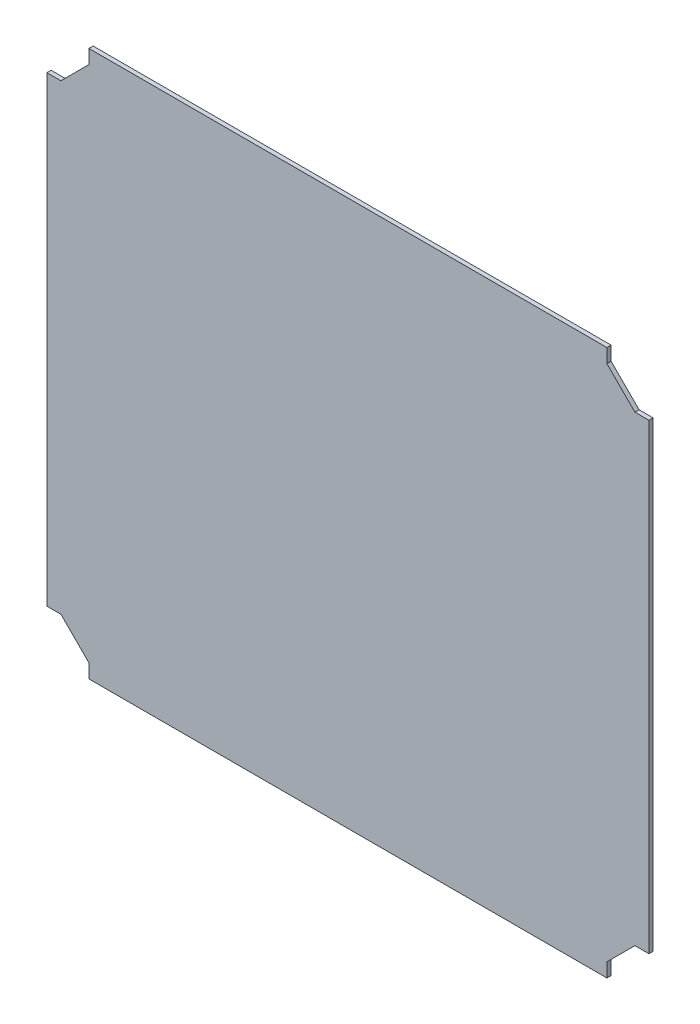
ISO-10303-21;
HEADER;
FILE_DESCRIPTION(('STEP AP214'),'2;1');
FILE_NAME('part.step','',(''),(''),'','','');
FILE_SCHEMA(('AUTOMOTIVE_DESIGN { 1 0 10303 214 1 1 1 1 }'));
ENDSEC;
DATA;
#1=APPLICATION_CONTEXT('core data for automotive mechanical design processes');
#2=APPLICATION_PROTOCOL_DEFINITION('international standard','automotive_design',2000,#1);
#3=PRODUCT_CONTEXT('',#1,'mechanical');
#4=PRODUCT('Part','Part','',(#3));
#5=PRODUCT_RELATED_PRODUCT_CATEGORY('part','',(#4));
#6=PRODUCT_DEFINITION_FORMATION('','',#4);
#7=PRODUCT_DEFINITION_CONTEXT('part definition',#1,'design');
#8=PRODUCT_DEFINITION('design','',#6,#7);
#9=PRODUCT_DEFINITION_SHAPE('','',#8);
#10=(LENGTH_UNIT() NAMED_UNIT(*) SI_UNIT(.MILLI.,.METRE.));
#11=(NAMED_UNIT(*) PLANE_ANGLE_UNIT() SI_UNIT($,.RADIAN.));
#12=(NAMED_UNIT(*) SI_UNIT($,.STERADIAN.) SOLID_ANGLE_UNIT());
#13=UNCERTAINTY_MEASURE_WITH_UNIT(LENGTH_MEASURE(1.E-05),#10,'distance_accuracy_value','');
#14=(GEOMETRIC_REPRESENTATION_CONTEXT(3) GLOBAL_UNCERTAINTY_ASSIGNED_CONTEXT((#13)) GLOBAL_UNIT_ASSIGNED_CONTEXT((#10,
#11,#12)) REPRESENTATION_CONTEXT('',''));
#15=CARTESIAN_POINT('',(0.,0.,0.));
#16=DIRECTION('',(0.,0.,1.));
#17=DIRECTION('',(1.,0.,0.));
#18=AXIS2_PLACEMENT_3D('',#15,#16,#17);
#19=CARTESIAN_POINT('',(-430.,-390.,6.));
#20=DIRECTION('',(1.,0.,0.));
#21=DIRECTION('',(0.,0.,-1.));
#22=AXIS2_PLACEMENT_3D('',#19,#20,#21);
#23=PLANE('',#22);
#24=DIRECTION('',(0.,-1.,0.));
#25=VECTOR('',#24,1.);
#26=CARTESIAN_POINT('',(-430.,-390.,0.));
#27=LINE('',#26,#25);
#28=CARTESIAN_POINT('',(-430.,330.,0.));
#29=VERTEX_POINT('',#28);
#30=CARTESIAN_POINT('',(-430.,-330.,0.));
#31=VERTEX_POINT('',#30);
#32=EDGE_CURVE('E184',#29,#31,#27,.T.);
#33=ORIENTED_EDGE('',*,*,#32,.T.);
#34=DIRECTION('',(0.,0.,1.));
#35=VECTOR('',#34,1.);
#36=CARTESIAN_POINT('',(-430.,-330.,-84.8528137423858));
#37=LINE('',#36,#35);
#38=CARTESIAN_POINT('',(-430.,-330.,6.));
#39=VERTEX_POINT('',#38);
#40=EDGE_CURVE('E291',#31,#39,#37,.T.);
#41=ORIENTED_EDGE('',*,*,#40,.T.);
#42=DIRECTION('',(0.,-1.,0.));
#43=VECTOR('',#42,1.);
#44=CARTESIAN_POINT('',(-430.,-390.,6.));
#45=LINE('',#44,#43);
#46=CARTESIAN_POINT('',(-430.,330.,6.));
#47=VERTEX_POINT('',#46);
#48=EDGE_CURVE('E195',#47,#39,#45,.T.);
#49=ORIENTED_EDGE('',*,*,#48,.F.);
#50=DIRECTION('',(0.,0.,1.));
#51=VECTOR('',#50,1.);
#52=CARTESIAN_POINT('',(-430.,330.,-84.8528137423858));
#53=LINE('',#52,#51);
#54=EDGE_CURVE('E314',#29,#47,#53,.T.);
#55=ORIENTED_EDGE('',*,*,#54,.F.);
#56=EDGE_LOOP('',(#33,#41,#49,#55));
#57=FACE_BOUND('',#56,.T.);
#58=ADVANCED_FACE('F35',(#57),#23,.F.);
#59=CARTESIAN_POINT('',(430.,-390.,6.));
#60=DIRECTION('',(0.,1.,0.));
#61=DIRECTION('',(-1.,0.,0.));
#62=AXIS2_PLACEMENT_3D('',#59,#60,#61);
#63=PLANE('',#62);
#64=DIRECTION('',(1.,0.,0.));
#65=VECTOR('',#64,1.);
#66=CARTESIAN_POINT('',(430.,-390.,6.));
#67=LINE('',#66,#65);
#68=CARTESIAN_POINT('',(-370.,-390.,6.));
#69=VERTEX_POINT('',#68);
#70=CARTESIAN_POINT('',(370.,-390.,6.));
#71=VERTEX_POINT('',#70);
#72=EDGE_CURVE('E180',#69,#71,#67,.T.);
#73=ORIENTED_EDGE('',*,*,#72,.F.);
#74=DIRECTION('',(0.,0.,1.));
#75=VECTOR('',#74,1.);
#76=CARTESIAN_POINT('',(-370.,-390.,-84.8528137423858));
#77=LINE('',#76,#75);
#78=CARTESIAN_POINT('',(-370.,-390.,0.));
#79=VERTEX_POINT('',#78);
#80=EDGE_CURVE('E305',#79,#69,#77,.T.);
#81=ORIENTED_EDGE('',*,*,#80,.F.);
#82=DIRECTION('',(1.,0.,0.));
#83=VECTOR('',#82,1.);
#84=CARTESIAN_POINT('',(430.,-390.,0.));
#85=LINE('',#84,#83);
#86=CARTESIAN_POINT('',(370.,-390.,0.));
#87=VERTEX_POINT('',#86);
#88=EDGE_CURVE('E187',#79,#87,#85,.T.);
#89=ORIENTED_EDGE('',*,*,#88,.T.);
#90=DIRECTION('',(0.,0.,1.));
#91=VECTOR('',#90,1.);
#92=CARTESIAN_POINT('',(370.,-390.,-84.8528137423858));
#93=LINE('',#92,#91);
#94=EDGE_CURVE('E325',#87,#71,#93,.T.);
#95=ORIENTED_EDGE('',*,*,#94,.T.);
#96=EDGE_LOOP('',(#73,#81,#89,#95));
#97=FACE_BOUND('',#96,.T.);
#98=ADVANCED_FACE('F250',(#97),#63,.F.);
#99=CARTESIAN_POINT('',(430.,-390.,6.));
#100=DIRECTION('',(-1.,0.,0.));
#101=DIRECTION('',(0.,0.,1.));
#102=AXIS2_PLACEMENT_3D('',#99,#100,#101);
#103=PLANE('',#102);
#104=DIRECTION('',(0.,1.,0.));
#105=VECTOR('',#104,1.);
#106=CARTESIAN_POINT('',(430.,-390.,6.));
#107=LINE('',#106,#105);
#108=CARTESIAN_POINT('',(430.,-330.,6.));
#109=VERTEX_POINT('',#108);
#110=CARTESIAN_POINT('',(430.,330.,6.));
#111=VERTEX_POINT('',#110);
#112=EDGE_CURVE('E174',#109,#111,#107,.T.);
#113=ORIENTED_EDGE('',*,*,#112,.F.);
#114=DIRECTION('',(0.,0.,1.));
#115=VECTOR('',#114,1.);
#116=CARTESIAN_POINT('',(430.,-330.,-84.8528137423858));
#117=LINE('',#116,#115);
#118=CARTESIAN_POINT('',(430.,-330.,0.));
#119=VERTEX_POINT('',#118);
#120=EDGE_CURVE('E330',#119,#109,#117,.T.);
#121=ORIENTED_EDGE('',*,*,#120,.F.);
#122=DIRECTION('',(0.,1.,0.));
#123=VECTOR('',#122,1.);
#124=CARTESIAN_POINT('',(430.,-390.,0.));
#125=LINE('',#124,#123);
#126=CARTESIAN_POINT('',(430.,330.,0.));
#127=VERTEX_POINT('',#126);
#128=EDGE_CURVE('E191',#119,#127,#125,.T.);
#129=ORIENTED_EDGE('',*,*,#128,.T.);
#130=DIRECTION('',(0.,0.,1.));
#131=VECTOR('',#130,1.);
#132=CARTESIAN_POINT('',(430.,330.,-84.8528137423858));
#133=LINE('',#132,#131);
#134=EDGE_CURVE('E159',#127,#111,#133,.T.);
#135=ORIENTED_EDGE('',*,*,#134,.T.);
#136=EDGE_LOOP('',(#113,#121,#129,#135));
#137=FACE_BOUND('',#136,.T.);
#138=ADVANCED_FACE('F256',(#137),#103,.F.);
#139=CARTESIAN_POINT('',(430.,390.,6.));
#140=DIRECTION('',(0.,-1.,0.));
#141=DIRECTION('',(1.,0.,0.));
#142=AXIS2_PLACEMENT_3D('',#139,#140,#141);
#143=PLANE('',#142);
#144=DIRECTION('',(-1.,0.,0.));
#145=VECTOR('',#144,1.);
#146=CARTESIAN_POINT('',(430.,390.,6.));
#147=LINE('',#146,#145);
#148=CARTESIAN_POINT('',(370.,390.,6.));
#149=VERTEX_POINT('',#148);
#150=CARTESIAN_POINT('',(-370.,390.,6.));
#151=VERTEX_POINT('',#150);
#152=EDGE_CURVE('E165',#149,#151,#147,.T.);
#153=ORIENTED_EDGE('',*,*,#152,.F.);
#154=DIRECTION('',(0.,0.,1.));
#155=VECTOR('',#154,1.);
#156=CARTESIAN_POINT('',(370.,390.,-84.8528137423858));
#157=LINE('',#156,#155);
#158=CARTESIAN_POINT('',(370.,390.,0.));
#159=VERTEX_POINT('',#158);
#160=EDGE_CURVE('E148',#159,#149,#157,.T.);
#161=ORIENTED_EDGE('',*,*,#160,.F.);
#162=DIRECTION('',(-1.,0.,0.));
#163=VECTOR('',#162,1.);
#164=CARTESIAN_POINT('',(430.,390.,0.));
#165=LINE('',#164,#163);
#166=CARTESIAN_POINT('',(-370.,390.,0.));
#167=VERTEX_POINT('',#166);
#168=EDGE_CURVE('E194',#159,#167,#165,.T.);
#169=ORIENTED_EDGE('',*,*,#168,.T.);
#170=DIRECTION('',(0.,0.,1.));
#171=VECTOR('',#170,1.);
#172=CARTESIAN_POINT('',(-370.,390.,-84.8528137423858));
#173=LINE('',#172,#171);
#174=EDGE_CURVE('E172',#167,#151,#173,.T.);
#175=ORIENTED_EDGE('',*,*,#174,.T.);
#176=EDGE_LOOP('',(#153,#161,#169,#175));
#177=FACE_BOUND('',#176,.T.);
#178=ADVANCED_FACE('F171',(#177),#143,.F.);
#179=CARTESIAN_POINT('',(0.,0.,6.));
#180=DIRECTION('',(0.,0.,1.));
#181=DIRECTION('',(1.,0.,0.));
#182=AXIS2_PLACEMENT_3D('',#179,#180,#181);
#183=PLANE('',#182);
#184=DIRECTION('',(-1.,0.,0.));
#185=VECTOR('',#184,1.);
#186=CARTESIAN_POINT('',(-430.,-330.,6.));
#187=LINE('',#186,#185);
#188=CARTESIAN_POINT('',(-410.,-330.,6.));
#189=VERTEX_POINT('',#188);
#190=EDGE_CURVE('E303',#189,#39,#187,.T.);
#191=ORIENTED_EDGE('',*,*,#190,.F.);
#192=DIRECTION('',(-0.707106781186552,0.707106781186543,0.));
#193=VECTOR('',#192,1.);
#194=CARTESIAN_POINT('',(-410.,-330.,6.00000000000001));
#195=LINE('',#194,#193);
#196=CARTESIAN_POINT('',(-370.,-370.,6.));
#197=VERTEX_POINT('',#196);
#198=EDGE_CURVE('E212',#189,#197,#195,.F.);
#199=ORIENTED_EDGE('',*,*,#198,.T.);
#200=DIRECTION('',(0.,1.,0.));
#201=VECTOR('',#200,1.);
#202=CARTESIAN_POINT('',(-370.,-390.,6.));
#203=LINE('',#202,#201);
#204=EDGE_CURVE('E300',#69,#197,#203,.T.);
#205=ORIENTED_EDGE('',*,*,#204,.F.);
#206=ORIENTED_EDGE('',*,*,#72,.T.);
#207=DIRECTION('',(0.,-1.,0.));
#208=VECTOR('',#207,1.);
#209=CARTESIAN_POINT('',(370.,-390.,6.));
#210=LINE('',#209,#208);
#211=CARTESIAN_POINT('',(370.,-370.,6.));
#212=VERTEX_POINT('',#211);
#213=EDGE_CURVE('E295',#212,#71,#210,.T.);
#214=ORIENTED_EDGE('',*,*,#213,.F.);
#215=DIRECTION('',(-0.707106781186543,-0.707106781186552,0.));
#216=VECTOR('',#215,1.);
#217=CARTESIAN_POINT('',(370.,-370.,6.00000000000001));
#218=LINE('',#217,#216);
#219=CARTESIAN_POINT('',(410.,-330.,6.));
#220=VERTEX_POINT('',#219);
#221=EDGE_CURVE('E216',#212,#220,#218,.F.);
#222=ORIENTED_EDGE('',*,*,#221,.T.);
#223=DIRECTION('',(-1.,0.,0.));
#224=VECTOR('',#223,1.);
#225=CARTESIAN_POINT('',(430.,-330.,6.));
#226=LINE('',#225,#224);
#227=EDGE_CURVE('E292',#109,#220,#226,.T.);
#228=ORIENTED_EDGE('',*,*,#227,.F.);
#229=ORIENTED_EDGE('',*,*,#112,.T.);
#230=DIRECTION('',(1.,0.,0.));
#231=VECTOR('',#230,1.);
#232=CARTESIAN_POINT('',(430.,330.,6.));
#233=LINE('',#232,#231);
#234=CARTESIAN_POINT('',(410.000000000001,330.,6.));
#235=VERTEX_POINT('',#234);
#236=EDGE_CURVE('E160',#235,#111,#233,.T.);
#237=ORIENTED_EDGE('',*,*,#236,.F.);
#238=DIRECTION('',(0.707106781186551,-0.707106781186544,0.));
#239=VECTOR('',#238,1.);
#240=CARTESIAN_POINT('',(410.000000000001,330.,6.00000000000001));
#241=LINE('',#240,#239);
#242=CARTESIAN_POINT('',(370.,370.,6.));
#243=VERTEX_POINT('',#242);
#244=EDGE_CURVE('E167',#235,#243,#241,.F.);
#245=ORIENTED_EDGE('',*,*,#244,.T.);
#246=DIRECTION('',(0.,-1.,0.));
#247=VECTOR('',#246,1.);
#248=CARTESIAN_POINT('',(370.,390.,6.));
#249=LINE('',#248,#247);
#250=EDGE_CURVE('E151',#149,#243,#249,.T.);
#251=ORIENTED_EDGE('',*,*,#250,.F.);
#252=ORIENTED_EDGE('',*,*,#152,.T.);
#253=DIRECTION('',(0.,1.,0.));
#254=VECTOR('',#253,1.);
#255=CARTESIAN_POINT('',(-370.,390.,6.));
#256=LINE('',#255,#254);
#257=CARTESIAN_POINT('',(-370.,370.000000000001,6.));
#258=VERTEX_POINT('',#257);
#259=EDGE_CURVE('E312',#258,#151,#256,.T.);
#260=ORIENTED_EDGE('',*,*,#259,.F.);
#261=DIRECTION('',(0.707106781186544,0.707106781186551,0.));
#262=VECTOR('',#261,1.);
#263=CARTESIAN_POINT('',(-370.,370.000000000001,6.00000000000001));
#264=LINE('',#263,#262);
#265=CARTESIAN_POINT('',(-410.,330.,6.));
#266=VERTEX_POINT('',#265);
#267=EDGE_CURVE('E44',#258,#266,#264,.F.);
#268=ORIENTED_EDGE('',*,*,#267,.T.);
#269=DIRECTION('',(1.,0.,0.));
#270=VECTOR('',#269,1.);
#271=CARTESIAN_POINT('',(-430.,330.,6.));
#272=LINE('',#271,#270);
#273=EDGE_CURVE('E235',#47,#266,#272,.T.);
#274=ORIENTED_EDGE('',*,*,#273,.F.);
#275=ORIENTED_EDGE('',*,*,#48,.T.);
#276=EDGE_LOOP('',(#191,#199,#205,#206,#214,#222,#228,#229,#237,#245,#251,#252,#260,#268,#274,#275));
#277=FACE_BOUND('',#276,.T.);
#278=ADVANCED_FACE('F164',(#277),#183,.T.);
#279=CARTESIAN_POINT('',(0.,0.,0.));
#280=DIRECTION('',(0.,0.,1.));
#281=DIRECTION('',(1.,0.,0.));
#282=AXIS2_PLACEMENT_3D('',#279,#280,#281);
#283=PLANE('',#282);
#284=DIRECTION('',(0.,-1.,0.));
#285=VECTOR('',#284,1.);
#286=CARTESIAN_POINT('',(-370.,-390.,0.));
#287=LINE('',#286,#285);
#288=CARTESIAN_POINT('',(-370.,-370.,0.));
#289=VERTEX_POINT('',#288);
#290=EDGE_CURVE('E288',#289,#79,#287,.T.);
#291=ORIENTED_EDGE('',*,*,#290,.F.);
#292=DIRECTION('',(0.707106781186552,-0.707106781186543,0.));
#293=VECTOR('',#292,1.);
#294=CARTESIAN_POINT('',(-369.999999999997,-370.000000000003,0.));
#295=LINE('',#294,#293);
#296=CARTESIAN_POINT('',(-410.,-330.,0.));
#297=VERTEX_POINT('',#296);
#298=EDGE_CURVE('E214',#289,#297,#295,.F.);
#299=ORIENTED_EDGE('',*,*,#298,.T.);
#300=DIRECTION('',(1.,0.,0.));
#301=VECTOR('',#300,1.);
#302=CARTESIAN_POINT('',(-430.,-330.,0.));
#303=LINE('',#302,#301);
#304=EDGE_CURVE('E286',#31,#297,#303,.T.);
#305=ORIENTED_EDGE('',*,*,#304,.F.);
#306=ORIENTED_EDGE('',*,*,#32,.F.);
#307=DIRECTION('',(-1.,0.,0.));
#308=VECTOR('',#307,1.);
#309=CARTESIAN_POINT('',(-430.,330.,0.));
#310=LINE('',#309,#308);
#311=CARTESIAN_POINT('',(-410.,330.,0.));
#312=VERTEX_POINT('',#311);
#313=EDGE_CURVE('E188',#312,#29,#310,.T.);
#314=ORIENTED_EDGE('',*,*,#313,.F.);
#315=DIRECTION('',(-0.707106781186544,-0.707106781186551,0.));
#316=VECTOR('',#315,1.);
#317=CARTESIAN_POINT('',(-370.000000000002,369.999999999998,0.));
#318=LINE('',#317,#316);
#319=CARTESIAN_POINT('',(-370.,370.000000000001,0.));
#320=VERTEX_POINT('',#319);
#321=EDGE_CURVE('E11',#312,#320,#318,.F.);
#322=ORIENTED_EDGE('',*,*,#321,.T.);
#323=DIRECTION('',(0.,-1.,0.));
#324=VECTOR('',#323,1.);
#325=CARTESIAN_POINT('',(-370.,390.,0.));
#326=LINE('',#325,#324);
#327=EDGE_CURVE('E308',#167,#320,#326,.T.);
#328=ORIENTED_EDGE('',*,*,#327,.F.);
#329=ORIENTED_EDGE('',*,*,#168,.F.);
#330=DIRECTION('',(0.,1.,0.));
#331=VECTOR('',#330,1.);
#332=CARTESIAN_POINT('',(370.,390.,0.));
#333=LINE('',#332,#331);
#334=CARTESIAN_POINT('',(370.,370.,0.));
#335=VERTEX_POINT('',#334);
#336=EDGE_CURVE('E154',#335,#159,#333,.T.);
#337=ORIENTED_EDGE('',*,*,#336,.F.);
#338=DIRECTION('',(-0.707106781186551,0.707106781186544,0.));
#339=VECTOR('',#338,1.);
#340=CARTESIAN_POINT('',(369.999999999998,370.000000000002,0.));
#341=LINE('',#340,#339);
#342=CARTESIAN_POINT('',(410.000000000001,330.,0.));
#343=VERTEX_POINT('',#342);
#344=EDGE_CURVE('E221',#335,#343,#341,.F.);
#345=ORIENTED_EDGE('',*,*,#344,.T.);
#346=DIRECTION('',(-1.,0.,0.));
#347=VECTOR('',#346,1.);
#348=CARTESIAN_POINT('',(430.,330.,0.));
#349=LINE('',#348,#347);
#350=EDGE_CURVE('E229',#127,#343,#349,.T.);
#351=ORIENTED_EDGE('',*,*,#350,.F.);
#352=ORIENTED_EDGE('',*,*,#128,.F.);
#353=DIRECTION('',(1.,0.,0.));
#354=VECTOR('',#353,1.);
#355=CARTESIAN_POINT('',(430.,-330.,0.));
#356=LINE('',#355,#354);
#357=CARTESIAN_POINT('',(410.,-330.,0.));
#358=VERTEX_POINT('',#357);
#359=EDGE_CURVE('E168',#358,#119,#356,.T.);
#360=ORIENTED_EDGE('',*,*,#359,.F.);
#361=DIRECTION('',(0.707106781186543,0.707106781186552,0.));
#362=VECTOR('',#361,1.);
#363=CARTESIAN_POINT('',(370.000000000003,-369.999999999998,0.));
#364=LINE('',#363,#362);
#365=CARTESIAN_POINT('',(370.,-370.,0.));
#366=VERTEX_POINT('',#365);
#367=EDGE_CURVE('E218',#358,#366,#364,.F.);
#368=ORIENTED_EDGE('',*,*,#367,.T.);
#369=DIRECTION('',(0.,1.,0.));
#370=VECTOR('',#369,1.);
#371=CARTESIAN_POINT('',(370.,-390.,0.));
#372=LINE('',#371,#370);
#373=EDGE_CURVE('E329',#87,#366,#372,.T.);
#374=ORIENTED_EDGE('',*,*,#373,.F.);
#375=ORIENTED_EDGE('',*,*,#88,.F.);
#376=EDGE_LOOP('',(#291,#299,#305,#306,#314,#322,#328,#329,#337,#345,#351,#352,#360,#368,#374,#375));
#377=FACE_BOUND('',#376,.T.);
#378=ADVANCED_FACE('F227',(#377),#283,.F.);
#379=CARTESIAN_POINT('',(-370.,390.,-84.8528137423858));
#380=DIRECTION('',(1.,0.,0.));
#381=DIRECTION('',(0.,0.,-1.));
#382=AXIS2_PLACEMENT_3D('',#379,#380,#381);
#383=PLANE('',#382);
#384=ORIENTED_EDGE('',*,*,#327,.T.);
#385=DIRECTION('',(0.,0.,1.));
#386=VECTOR('',#385,1.);
#387=CARTESIAN_POINT('',(-370.,370.000000000001,6.));
#388=LINE('',#387,#386);
#389=EDGE_CURVE('E208',#320,#258,#388,.T.);
#390=ORIENTED_EDGE('',*,*,#389,.T.);
#391=ORIENTED_EDGE('',*,*,#259,.T.);
#392=ORIENTED_EDGE('',*,*,#174,.F.);
#393=EDGE_LOOP('',(#384,#390,#391,#392));
#394=FACE_BOUND('',#393,.T.);
#395=ADVANCED_FACE('F358',(#394),#383,.F.);
#396=CARTESIAN_POINT('',(-430.,330.,-84.8528137423858));
#397=DIRECTION('',(0.,-1.,0.));
#398=DIRECTION('',(0.,0.,-1.));
#399=AXIS2_PLACEMENT_3D('',#396,#397,#398);
#400=PLANE('',#399);
#401=ORIENTED_EDGE('',*,*,#273,.T.);
#402=DIRECTION('',(0.,0.,-1.));
#403=VECTOR('',#402,1.);
#404=CARTESIAN_POINT('',(-410.,330.,0.));
#405=LINE('',#404,#403);
#406=EDGE_CURVE('E57',#266,#312,#405,.T.);
#407=ORIENTED_EDGE('',*,*,#406,.T.);
#408=ORIENTED_EDGE('',*,*,#313,.T.);
#409=ORIENTED_EDGE('',*,*,#54,.T.);
#410=EDGE_LOOP('',(#401,#407,#408,#409));
#411=FACE_BOUND('',#410,.T.);
#412=ADVANCED_FACE('F361',(#411),#400,.F.);
#413=CARTESIAN_POINT('',(430.,330.,-84.8528137423858));
#414=DIRECTION('',(0.,-1.,0.));
#415=DIRECTION('',(0.,0.,-1.));
#416=AXIS2_PLACEMENT_3D('',#413,#414,#415);
#417=PLANE('',#416);
#418=ORIENTED_EDGE('',*,*,#350,.T.);
#419=DIRECTION('',(0.,0.,1.));
#420=VECTOR('',#419,1.);
#421=CARTESIAN_POINT('',(410.000000000001,330.,6.));
#422=LINE('',#421,#420);
#423=EDGE_CURVE('E203',#343,#235,#422,.T.);
#424=ORIENTED_EDGE('',*,*,#423,.T.);
#425=ORIENTED_EDGE('',*,*,#236,.T.);
#426=ORIENTED_EDGE('',*,*,#134,.F.);
#427=EDGE_LOOP('',(#418,#424,#425,#426));
#428=FACE_BOUND('',#427,.T.);
#429=ADVANCED_FACE('F233',(#428),#417,.F.);
#430=CARTESIAN_POINT('',(370.,390.,-84.8528137423858));
#431=DIRECTION('',(-1.,0.,0.));
#432=DIRECTION('',(0.,0.,1.));
#433=AXIS2_PLACEMENT_3D('',#430,#431,#432);
#434=PLANE('',#433);
#435=ORIENTED_EDGE('',*,*,#250,.T.);
#436=DIRECTION('',(0.,0.,-1.));
#437=VECTOR('',#436,1.);
#438=CARTESIAN_POINT('',(370.,370.,0.));
#439=LINE('',#438,#437);
#440=EDGE_CURVE('E206',#243,#335,#439,.T.);
#441=ORIENTED_EDGE('',*,*,#440,.T.);
#442=ORIENTED_EDGE('',*,*,#336,.T.);
#443=ORIENTED_EDGE('',*,*,#160,.T.);
#444=EDGE_LOOP('',(#435,#441,#442,#443));
#445=FACE_BOUND('',#444,.T.);
#446=ADVANCED_FACE('F150',(#445),#434,.F.);
#447=CARTESIAN_POINT('',(370.,-390.,-84.8528137423858));
#448=DIRECTION('',(-1.,0.,0.));
#449=DIRECTION('',(0.,0.,1.));
#450=AXIS2_PLACEMENT_3D('',#447,#448,#449);
#451=PLANE('',#450);
#452=ORIENTED_EDGE('',*,*,#373,.T.);
#453=DIRECTION('',(0.,0.,1.));
#454=VECTOR('',#453,1.);
#455=CARTESIAN_POINT('',(370.,-370.,6.));
#456=LINE('',#455,#454);
#457=EDGE_CURVE('E198',#366,#212,#456,.T.);
#458=ORIENTED_EDGE('',*,*,#457,.T.);
#459=ORIENTED_EDGE('',*,*,#213,.T.);
#460=ORIENTED_EDGE('',*,*,#94,.F.);
#461=EDGE_LOOP('',(#452,#458,#459,#460));
#462=FACE_BOUND('',#461,.T.);
#463=ADVANCED_FACE('F345',(#462),#451,.F.);
#464=CARTESIAN_POINT('',(430.,-330.,-84.8528137423858));
#465=DIRECTION('',(0.,1.,0.));
#466=DIRECTION('',(0.,0.,1.));
#467=AXIS2_PLACEMENT_3D('',#464,#465,#466);
#468=PLANE('',#467);
#469=ORIENTED_EDGE('',*,*,#227,.T.);
#470=DIRECTION('',(0.,0.,-1.));
#471=VECTOR('',#470,1.);
#472=CARTESIAN_POINT('',(410.,-330.,0.));
#473=LINE('',#472,#471);
#474=EDGE_CURVE('E201',#220,#358,#473,.T.);
#475=ORIENTED_EDGE('',*,*,#474,.T.);
#476=ORIENTED_EDGE('',*,*,#359,.T.);
#477=ORIENTED_EDGE('',*,*,#120,.T.);
#478=EDGE_LOOP('',(#469,#475,#476,#477));
#479=FACE_BOUND('',#478,.T.);
#480=ADVANCED_FACE('F338',(#479),#468,.F.);
#481=CARTESIAN_POINT('',(-430.,-330.,-84.8528137423858));
#482=DIRECTION('',(0.,1.,0.));
#483=DIRECTION('',(0.,0.,1.));
#484=AXIS2_PLACEMENT_3D('',#481,#482,#483);
#485=PLANE('',#484);
#486=ORIENTED_EDGE('',*,*,#304,.T.);
#487=DIRECTION('',(0.,0.,1.));
#488=VECTOR('',#487,1.);
#489=CARTESIAN_POINT('',(-410.,-330.,6.));
#490=LINE('',#489,#488);
#491=EDGE_CURVE('E173',#297,#189,#490,.T.);
#492=ORIENTED_EDGE('',*,*,#491,.T.);
#493=ORIENTED_EDGE('',*,*,#190,.T.);
#494=ORIENTED_EDGE('',*,*,#40,.F.);
#495=EDGE_LOOP('',(#486,#492,#493,#494));
#496=FACE_BOUND('',#495,.T.);
#497=ADVANCED_FACE('F277',(#496),#485,.F.);
#498=CARTESIAN_POINT('',(-370.,-390.,-84.8528137423858));
#499=DIRECTION('',(1.,0.,0.));
#500=DIRECTION('',(0.,0.,-1.));
#501=AXIS2_PLACEMENT_3D('',#498,#499,#500);
#502=PLANE('',#501);
#503=ORIENTED_EDGE('',*,*,#204,.T.);
#504=DIRECTION('',(0.,0.,-1.));
#505=VECTOR('',#504,1.);
#506=CARTESIAN_POINT('',(-370.,-370.,0.));
#507=LINE('',#506,#505);
#508=EDGE_CURVE('E177',#197,#289,#507,.T.);
#509=ORIENTED_EDGE('',*,*,#508,.T.);
#510=ORIENTED_EDGE('',*,*,#290,.T.);
#511=ORIENTED_EDGE('',*,*,#80,.T.);
#512=EDGE_LOOP('',(#503,#509,#510,#511));
#513=FACE_BOUND('',#512,.T.);
#514=ADVANCED_FACE('F266',(#513),#502,.F.);
#515=CARTESIAN_POINT('',(-410.,-330.,-84.8528137423858));
#516=DIRECTION('',(-0.707106781186542,-0.707106781186552,0.));
#517=DIRECTION('',(0.,0.,-1.));
#518=AXIS2_PLACEMENT_3D('',#515,#516,#517);
#519=PLANE('',#518);
#520=ORIENTED_EDGE('',*,*,#298,.F.);
#521=ORIENTED_EDGE('',*,*,#508,.F.);
#522=ORIENTED_EDGE('',*,*,#198,.F.);
#523=ORIENTED_EDGE('',*,*,#491,.F.);
#524=EDGE_LOOP('',(#520,#521,#522,#523));
#525=FACE_BOUND('',#524,.T.);
#526=ADVANCED_FACE('F245',(#525),#519,.T.);
#527=CARTESIAN_POINT('',(370.,-370.,-84.8528137423858));
#528=DIRECTION('',(0.707106781186552,-0.707106781186542,0.));
#529=DIRECTION('',(0.,0.,-1.));
#530=AXIS2_PLACEMENT_3D('',#527,#528,#529);
#531=PLANE('',#530);
#532=ORIENTED_EDGE('',*,*,#367,.F.);
#533=ORIENTED_EDGE('',*,*,#474,.F.);
#534=ORIENTED_EDGE('',*,*,#221,.F.);
#535=ORIENTED_EDGE('',*,*,#457,.F.);
#536=EDGE_LOOP('',(#532,#533,#534,#535));
#537=FACE_BOUND('',#536,.T.);
#538=ADVANCED_FACE('F239',(#537),#531,.T.);
#539=CARTESIAN_POINT('',(410.000000000001,330.,-84.8528137423858));
#540=DIRECTION('',(0.707106781186544,0.707106781186551,0.));
#541=DIRECTION('',(0.,0.,-1.));
#542=AXIS2_PLACEMENT_3D('',#539,#540,#541);
#543=PLANE('',#542);
#544=ORIENTED_EDGE('',*,*,#344,.F.);
#545=ORIENTED_EDGE('',*,*,#440,.F.);
#546=ORIENTED_EDGE('',*,*,#244,.F.);
#547=ORIENTED_EDGE('',*,*,#423,.F.);
#548=EDGE_LOOP('',(#544,#545,#546,#547));
#549=FACE_BOUND('',#548,.T.);
#550=ADVANCED_FACE('F237',(#549),#543,.T.);
#551=CARTESIAN_POINT('',(-370.,370.000000000001,-84.8528137423858));
#552=DIRECTION('',(-0.707106781186551,0.707106781186544,0.));
#553=DIRECTION('',(0.,0.,-1.));
#554=AXIS2_PLACEMENT_3D('',#551,#552,#553);
#555=PLANE('',#554);
#556=ORIENTED_EDGE('',*,*,#321,.F.);
#557=ORIENTED_EDGE('',*,*,#406,.F.);
#558=ORIENTED_EDGE('',*,*,#267,.F.);
#559=ORIENTED_EDGE('',*,*,#389,.F.);
#560=EDGE_LOOP('',(#556,#557,#558,#559));
#561=FACE_BOUND('',#560,.T.);
#562=ADVANCED_FACE('F38',(#561),#555,.T.);
#563=CLOSED_SHELL('',(#58,#98,#138,#178,#278,#378,#395,#412,#429,#446,#463,#480,#497,#514,#526,
#538,#550,#562));
#564=MANIFOLD_SOLID_BREP('B2',#563);
#565=ADVANCED_BREP_SHAPE_REPRESENTATION('',(#18,#564),#14);
#566=SHAPE_DEFINITION_REPRESENTATION(#9,#565);
ENDSEC;
END-ISO-10303-21;
